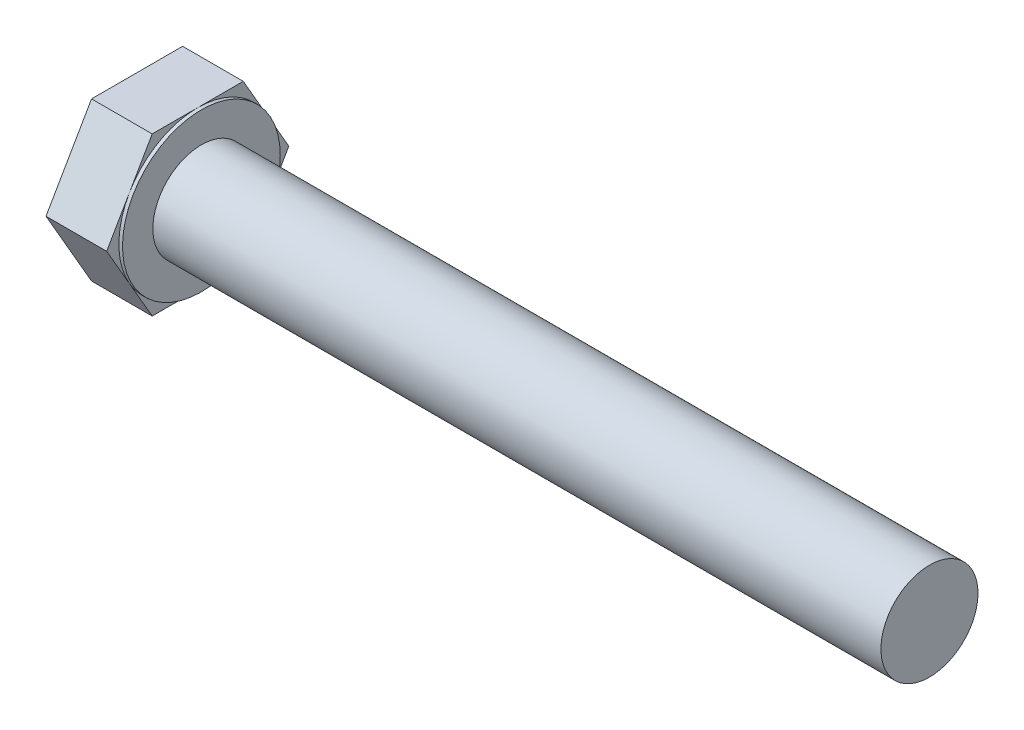
ISO-10303-21;
HEADER;
FILE_DESCRIPTION(('STEP AP214'),'2;1');
FILE_NAME('part.step','',(''),(''),'','','');
FILE_SCHEMA(('AUTOMOTIVE_DESIGN { 1 0 10303 214 1 1 1 1 }'));
ENDSEC;
DATA;
#1=APPLICATION_CONTEXT('core data for automotive mechanical design processes');
#2=APPLICATION_PROTOCOL_DEFINITION('international standard','automotive_design',2000,#1);
#3=PRODUCT_CONTEXT('',#1,'mechanical');
#4=PRODUCT('Part','Part','',(#3));
#5=PRODUCT_RELATED_PRODUCT_CATEGORY('part','',(#4));
#6=PRODUCT_DEFINITION_FORMATION('','',#4);
#7=PRODUCT_DEFINITION_CONTEXT('part definition',#1,'design');
#8=PRODUCT_DEFINITION('design','',#6,#7);
#9=PRODUCT_DEFINITION_SHAPE('','',#8);
#10=(LENGTH_UNIT() NAMED_UNIT(*) SI_UNIT(.MILLI.,.METRE.));
#11=(NAMED_UNIT(*) PLANE_ANGLE_UNIT() SI_UNIT($,.RADIAN.));
#12=(NAMED_UNIT(*) SI_UNIT($,.STERADIAN.) SOLID_ANGLE_UNIT());
#13=UNCERTAINTY_MEASURE_WITH_UNIT(LENGTH_MEASURE(1.E-05),#10,'distance_accuracy_value','');
#14=(GEOMETRIC_REPRESENTATION_CONTEXT(3) GLOBAL_UNCERTAINTY_ASSIGNED_CONTEXT((#13)) GLOBAL_UNIT_ASSIGNED_CONTEXT((#10,
#11,#12)) REPRESENTATION_CONTEXT('',''));
#15=CARTESIAN_POINT('',(0.,0.,0.));
#16=DIRECTION('',(0.,0.,1.));
#17=DIRECTION('',(1.,0.,0.));
#18=AXIS2_PLACEMENT_3D('',#15,#16,#17);
#19=CARTESIAN_POINT('',(0.3,0.,0.));
#20=DIRECTION('',(1.,0.,0.));
#21=DIRECTION('',(0.,0.,-1.));
#22=AXIS2_PLACEMENT_3D('',#19,#20,#21);
#23=PLANE('',#22);
#24=CARTESIAN_POINT('',(0.3,0.,0.));
#25=DIRECTION('',(1.,0.,0.));
#26=DIRECTION('',(0.,0.,-1.));
#27=AXIS2_PLACEMENT_3D('',#24,#25,#26);
#28=CIRCLE('',#27,6.50000000000004);
#29=CARTESIAN_POINT('',(0.3,0.,-6.50000000000004));
#30=VERTEX_POINT('',#29);
#31=EDGE_CURVE('E128',#30,#30,#28,.T.);
#32=ORIENTED_EDGE('',*,*,#31,.T.);
#33=EDGE_LOOP('',(#32));
#34=FACE_BOUND('',#33,.T.);
#35=CARTESIAN_POINT('',(0.3,0.,0.));
#36=DIRECTION('',(1.,0.,0.));
#37=DIRECTION('',(0.,0.,-1.));
#38=AXIS2_PLACEMENT_3D('',#35,#36,#37);
#39=CIRCLE('',#38,4.);
#40=CARTESIAN_POINT('',(0.3,0.,-4.));
#41=VERTEX_POINT('',#40);
#42=EDGE_CURVE('E351',#41,#41,#39,.T.);
#43=ORIENTED_EDGE('',*,*,#42,.F.);
#44=EDGE_LOOP('',(#43));
#45=FACE_BOUND('',#44,.T.);
#46=ADVANCED_FACE('F35',(#34,#45),#23,.T.);
#47=CARTESIAN_POINT('',(0.,0.,0.));
#48=DIRECTION('',(1.,0.,0.));
#49=DIRECTION('',(0.,0.,-1.));
#50=AXIS2_PLACEMENT_3D('',#47,#48,#49);
#51=PLANE('',#50);
#52=CARTESIAN_POINT('',(0.,0.,0.));
#53=DIRECTION('',(1.,0.,0.));
#54=DIRECTION('',(0.,0.,-1.));
#55=AXIS2_PLACEMENT_3D('',#52,#53,#54);
#56=CIRCLE('',#55,6.50000000000004);
#57=CARTESIAN_POINT('',(0.,3.25000000000007,-5.62916512459886));
#58=VERTEX_POINT('',#57);
#59=CARTESIAN_POINT('',(0.,6.5,0.));
#60=VERTEX_POINT('',#59);
#61=EDGE_CURVE('E46',#58,#60,#56,.T.);
#62=ORIENTED_EDGE('',*,*,#61,.F.);
#63=DIRECTION('',(0.,0.866025403784435,0.500000000000007));
#64=VECTOR('',#63,1.);
#65=CARTESIAN_POINT('',(0.,0.,-7.50555349946514));
#66=LINE('',#65,#64);
#67=CARTESIAN_POINT('',(0.,6.50000000000004,-3.75277674973251));
#68=VERTEX_POINT('',#67);
#69=EDGE_CURVE('E113',#58,#68,#66,.T.);
#70=ORIENTED_EDGE('',*,*,#69,.T.);
#71=DIRECTION('',(0.,0.,1.));
#72=VECTOR('',#71,1.);
#73=CARTESIAN_POINT('',(0.,6.50000000000004,-3.75277674973251));
#74=LINE('',#73,#72);
#75=EDGE_CURVE('E126',#68,#60,#74,.T.);
#76=ORIENTED_EDGE('',*,*,#75,.T.);
#77=EDGE_LOOP('',(#62,#70,#76));
#78=FACE_BOUND('',#77,.T.);
#79=ADVANCED_FACE('F125',(#78),#51,.T.);
#80=CARTESIAN_POINT('',(0.,3.24999999999998,5.62916512459889));
#81=VERTEX_POINT('',#80);
#82=EDGE_CURVE('E11',#60,#81,#56,.T.);
#83=ORIENTED_EDGE('',*,*,#82,.F.);
#84=CARTESIAN_POINT('',(0.,6.49999999999996,3.75277674973265));
#85=VERTEX_POINT('',#84);
#86=EDGE_CURVE('E112',#60,#85,#74,.T.);
#87=ORIENTED_EDGE('',*,*,#86,.T.);
#88=DIRECTION('',(0.,-0.866025403784442,0.499999999999995));
#89=VECTOR('',#88,1.);
#90=CARTESIAN_POINT('',(0.,6.49999999999996,3.75277674973265));
#91=LINE('',#90,#89);
#92=EDGE_CURVE('E158',#85,#81,#91,.T.);
#93=ORIENTED_EDGE('',*,*,#92,.T.);
#94=EDGE_LOOP('',(#83,#87,#93));
#95=FACE_BOUND('',#94,.T.);
#96=ADVANCED_FACE('F211',(#95),#51,.T.);
#97=CARTESIAN_POINT('',(0.,-3.25000000000001,5.62916512459885));
#98=VERTEX_POINT('',#97);
#99=EDGE_CURVE('E44',#81,#98,#56,.T.);
#100=ORIENTED_EDGE('',*,*,#99,.F.);
#101=CARTESIAN_POINT('',(0.,0.,7.50555349946514));
#102=VERTEX_POINT('',#101);
#103=EDGE_CURVE('E161',#81,#102,#91,.T.);
#104=ORIENTED_EDGE('',*,*,#103,.T.);
#105=DIRECTION('',(0.,-0.866025403784438,-0.500000000000001));
#106=VECTOR('',#105,1.);
#107=CARTESIAN_POINT('',(0.,0.,7.50555349946514));
#108=LINE('',#107,#106);
#109=EDGE_CURVE('E162',#102,#98,#108,.T.);
#110=ORIENTED_EDGE('',*,*,#109,.T.);
#111=EDGE_LOOP('',(#100,#104,#110));
#112=FACE_BOUND('',#111,.T.);
#113=ADVANCED_FACE('F192',(#112),#51,.T.);
#114=CARTESIAN_POINT('',(0.,-6.5,0.));
#115=VERTEX_POINT('',#114);
#116=EDGE_CURVE('E135',#98,#115,#56,.T.);
#117=ORIENTED_EDGE('',*,*,#116,.F.);
#118=CARTESIAN_POINT('',(0.,-6.50000000000001,3.75277674973255));
#119=VERTEX_POINT('',#118);
#120=EDGE_CURVE('E160',#98,#119,#108,.T.);
#121=ORIENTED_EDGE('',*,*,#120,.T.);
#122=DIRECTION('',(0.,0.,-1.));
#123=VECTOR('',#122,1.);
#124=CARTESIAN_POINT('',(0.,-6.50000000000001,3.75277674973255));
#125=LINE('',#124,#123);
#126=EDGE_CURVE('E166',#119,#115,#125,.T.);
#127=ORIENTED_EDGE('',*,*,#126,.T.);
#128=EDGE_LOOP('',(#117,#121,#127));
#129=FACE_BOUND('',#128,.T.);
#130=ADVANCED_FACE('F194',(#129),#51,.T.);
#131=CARTESIAN_POINT('',(0.,-3.24999999999997,-5.62916512459887));
#132=VERTEX_POINT('',#131);
#133=EDGE_CURVE('E133',#115,#132,#56,.T.);
#134=ORIENTED_EDGE('',*,*,#133,.F.);
#135=CARTESIAN_POINT('',(0.,-6.49999999999999,-3.7527767497326));
#136=VERTEX_POINT('',#135);
#137=EDGE_CURVE('E165',#115,#136,#125,.T.);
#138=ORIENTED_EDGE('',*,*,#137,.T.);
#139=DIRECTION('',(0.,0.866025403784442,-0.499999999999995));
#140=VECTOR('',#139,1.);
#141=CARTESIAN_POINT('',(0.,-6.49999999999999,-3.7527767497326));
#142=LINE('',#141,#140);
#143=EDGE_CURVE('E123',#136,#132,#142,.T.);
#144=ORIENTED_EDGE('',*,*,#143,.T.);
#145=EDGE_LOOP('',(#134,#138,#144));
#146=FACE_BOUND('',#145,.T.);
#147=ADVANCED_FACE('F201',(#146),#51,.T.);
#148=CARTESIAN_POINT('',(-5.,6.49999999999996,3.75277674973265));
#149=DIRECTION('',(0.,0.499999999999995,0.866025403784442));
#150=DIRECTION('',(0.,-0.866025403784442,0.499999999999995));
#151=AXIS2_PLACEMENT_3D('',#148,#149,#150);
#152=PLANE('',#151);
#153=ORIENTED_EDGE('',*,*,#92,.F.);
#154=DIRECTION('',(1.,0.,0.));
#155=VECTOR('',#154,1.);
#156=CARTESIAN_POINT('',(-5.,6.49999999999996,3.75277674973265));
#157=LINE('',#156,#155);
#158=CARTESIAN_POINT('',(-5.,6.49999999999996,3.75277674973265));
#159=VERTEX_POINT('',#158);
#160=EDGE_CURVE('E134',#159,#85,#157,.T.);
#161=ORIENTED_EDGE('',*,*,#160,.F.);
#162=DIRECTION('',(0.,-0.866025403784442,0.499999999999995));
#163=VECTOR('',#162,1.);
#164=CARTESIAN_POINT('',(-5.,6.49999999999996,3.75277674973265));
#165=LINE('',#164,#163);
#166=CARTESIAN_POINT('',(-5.,0.,7.50555349946514));
#167=VERTEX_POINT('',#166);
#168=EDGE_CURVE('E141',#159,#167,#165,.T.);
#169=ORIENTED_EDGE('',*,*,#168,.T.);
#170=DIRECTION('',(1.,0.,0.));
#171=VECTOR('',#170,1.);
#172=CARTESIAN_POINT('',(-5.,0.,7.50555349946514));
#173=LINE('',#172,#171);
#174=EDGE_CURVE('E39',#167,#102,#173,.T.);
#175=ORIENTED_EDGE('',*,*,#174,.T.);
#176=ORIENTED_EDGE('',*,*,#103,.F.);
#177=EDGE_LOOP('',(#153,#161,#169,#175,#176));
#178=FACE_BOUND('',#177,.T.);
#179=ADVANCED_FACE('F37',(#178),#152,.T.);
#180=CARTESIAN_POINT('',(-5.,6.50000000000004,-3.75277674973251));
#181=DIRECTION('',(0.,1.,0.));
#182=DIRECTION('',(0.,0.,1.));
#183=AXIS2_PLACEMENT_3D('',#180,#181,#182);
#184=PLANE('',#183);
#185=ORIENTED_EDGE('',*,*,#75,.F.);
#186=DIRECTION('',(1.,0.,0.));
#187=VECTOR('',#186,1.);
#188=CARTESIAN_POINT('',(-5.,6.50000000000004,-3.75277674973251));
#189=LINE('',#188,#187);
#190=CARTESIAN_POINT('',(-5.,6.50000000000004,-3.75277674973251));
#191=VERTEX_POINT('',#190);
#192=EDGE_CURVE('E119',#191,#68,#189,.T.);
#193=ORIENTED_EDGE('',*,*,#192,.F.);
#194=DIRECTION('',(0.,0.,1.));
#195=VECTOR('',#194,1.);
#196=CARTESIAN_POINT('',(-5.,6.50000000000004,-3.75277674973251));
#197=LINE('',#196,#195);
#198=EDGE_CURVE('E155',#191,#159,#197,.T.);
#199=ORIENTED_EDGE('',*,*,#198,.T.);
#200=ORIENTED_EDGE('',*,*,#160,.T.);
#201=ORIENTED_EDGE('',*,*,#86,.F.);
#202=EDGE_LOOP('',(#185,#193,#199,#200,#201));
#203=FACE_BOUND('',#202,.T.);
#204=ADVANCED_FACE('F210',(#203),#184,.T.);
#205=CARTESIAN_POINT('',(-5.,0.,-7.50555349946514));
#206=DIRECTION('',(0.,0.500000000000007,-0.866025403784435));
#207=DIRECTION('',(0.,0.866025403784435,0.500000000000007));
#208=AXIS2_PLACEMENT_3D('',#205,#206,#207);
#209=PLANE('',#208);
#210=CARTESIAN_POINT('',(0.,0.,-7.50555349946514));
#211=VERTEX_POINT('',#210);
#212=EDGE_CURVE('E106',#211,#58,#66,.T.);
#213=ORIENTED_EDGE('',*,*,#212,.F.);
#214=DIRECTION('',(1.,0.,0.));
#215=VECTOR('',#214,1.);
#216=CARTESIAN_POINT('',(-5.,0.,-7.50555349946514));
#217=LINE('',#216,#215);
#218=CARTESIAN_POINT('',(-5.,0.,-7.50555349946514));
#219=VERTEX_POINT('',#218);
#220=EDGE_CURVE('E173',#219,#211,#217,.T.);
#221=ORIENTED_EDGE('',*,*,#220,.F.);
#222=DIRECTION('',(0.,0.866025403784435,0.500000000000007));
#223=VECTOR('',#222,1.);
#224=CARTESIAN_POINT('',(-5.,0.,-7.50555349946514));
#225=LINE('',#224,#223);
#226=EDGE_CURVE('E153',#219,#191,#225,.T.);
#227=ORIENTED_EDGE('',*,*,#226,.T.);
#228=ORIENTED_EDGE('',*,*,#192,.T.);
#229=ORIENTED_EDGE('',*,*,#69,.F.);
#230=EDGE_LOOP('',(#213,#221,#227,#228,#229));
#231=FACE_BOUND('',#230,.T.);
#232=ADVANCED_FACE('F117',(#231),#209,.T.);
#233=CARTESIAN_POINT('',(-5.,-6.49999999999999,-3.7527767497326));
#234=DIRECTION('',(0.,-0.499999999999995,-0.866025403784442));
#235=DIRECTION('',(0.,0.866025403784442,-0.499999999999995));
#236=AXIS2_PLACEMENT_3D('',#233,#234,#235);
#237=PLANE('',#236);
#238=ORIENTED_EDGE('',*,*,#143,.F.);
#239=DIRECTION('',(1.,0.,0.));
#240=VECTOR('',#239,1.);
#241=CARTESIAN_POINT('',(-5.,-6.49999999999999,-3.7527767497326));
#242=LINE('',#241,#240);
#243=CARTESIAN_POINT('',(-5.,-6.49999999999999,-3.7527767497326));
#244=VERTEX_POINT('',#243);
#245=EDGE_CURVE('E175',#244,#136,#242,.T.);
#246=ORIENTED_EDGE('',*,*,#245,.F.);
#247=DIRECTION('',(0.,0.866025403784442,-0.499999999999995));
#248=VECTOR('',#247,1.);
#249=CARTESIAN_POINT('',(-5.,-6.49999999999999,-3.7527767497326));
#250=LINE('',#249,#248);
#251=EDGE_CURVE('E150',#244,#219,#250,.T.);
#252=ORIENTED_EDGE('',*,*,#251,.T.);
#253=ORIENTED_EDGE('',*,*,#220,.T.);
#254=EDGE_CURVE('E109',#132,#211,#142,.T.);
#255=ORIENTED_EDGE('',*,*,#254,.F.);
#256=EDGE_LOOP('',(#238,#246,#252,#253,#255));
#257=FACE_BOUND('',#256,.T.);
#258=ADVANCED_FACE('F203',(#257),#237,.T.);
#259=CARTESIAN_POINT('',(-5.,-6.50000000000001,3.75277674973255));
#260=DIRECTION('',(0.,-1.,0.));
#261=DIRECTION('',(0.,0.,-1.));
#262=AXIS2_PLACEMENT_3D('',#259,#260,#261);
#263=PLANE('',#262);
#264=ORIENTED_EDGE('',*,*,#126,.F.);
#265=DIRECTION('',(1.,0.,0.));
#266=VECTOR('',#265,1.);
#267=CARTESIAN_POINT('',(-5.,-6.50000000000001,3.75277674973255));
#268=LINE('',#267,#266);
#269=CARTESIAN_POINT('',(-5.,-6.50000000000001,3.75277674973255));
#270=VERTEX_POINT('',#269);
#271=EDGE_CURVE('E177',#270,#119,#268,.T.);
#272=ORIENTED_EDGE('',*,*,#271,.F.);
#273=DIRECTION('',(0.,0.,-1.));
#274=VECTOR('',#273,1.);
#275=CARTESIAN_POINT('',(-5.,-6.50000000000001,3.75277674973255));
#276=LINE('',#275,#274);
#277=EDGE_CURVE('E147',#270,#244,#276,.T.);
#278=ORIENTED_EDGE('',*,*,#277,.T.);
#279=ORIENTED_EDGE('',*,*,#245,.T.);
#280=ORIENTED_EDGE('',*,*,#137,.F.);
#281=EDGE_LOOP('',(#264,#272,#278,#279,#280));
#282=FACE_BOUND('',#281,.T.);
#283=ADVANCED_FACE('F197',(#282),#263,.T.);
#284=CARTESIAN_POINT('',(-5.,0.,7.50555349946514));
#285=DIRECTION('',(0.,-0.500000000000001,0.866025403784438));
#286=DIRECTION('',(0.,-0.866025403784438,-0.500000000000001));
#287=AXIS2_PLACEMENT_3D('',#284,#285,#286);
#288=PLANE('',#287);
#289=ORIENTED_EDGE('',*,*,#109,.F.);
#290=ORIENTED_EDGE('',*,*,#174,.F.);
#291=DIRECTION('',(0.,-0.866025403784438,-0.500000000000001));
#292=VECTOR('',#291,1.);
#293=CARTESIAN_POINT('',(-5.,0.,7.50555349946514));
#294=LINE('',#293,#292);
#295=EDGE_CURVE('E144',#167,#270,#294,.T.);
#296=ORIENTED_EDGE('',*,*,#295,.T.);
#297=ORIENTED_EDGE('',*,*,#271,.T.);
#298=ORIENTED_EDGE('',*,*,#120,.F.);
#299=EDGE_LOOP('',(#289,#290,#296,#297,#298));
#300=FACE_BOUND('',#299,.T.);
#301=ADVANCED_FACE('F189',(#300),#288,.T.);
#302=CARTESIAN_POINT('',(-5.,0.,0.));
#303=DIRECTION('',(1.,0.,0.));
#304=DIRECTION('',(0.,0.,-1.));
#305=AXIS2_PLACEMENT_3D('',#302,#303,#304);
#306=PLANE('',#305);
#307=ORIENTED_EDGE('',*,*,#168,.F.);
#308=ORIENTED_EDGE('',*,*,#198,.F.);
#309=ORIENTED_EDGE('',*,*,#226,.F.);
#310=ORIENTED_EDGE('',*,*,#251,.F.);
#311=ORIENTED_EDGE('',*,*,#277,.F.);
#312=ORIENTED_EDGE('',*,*,#295,.F.);
#313=EDGE_LOOP('',(#307,#308,#309,#310,#311,#312));
#314=FACE_BOUND('',#313,.T.);
#315=ADVANCED_FACE('F208',(#314),#306,.F.);
#316=EDGE_CURVE('E59',#132,#58,#56,.T.);
#317=ORIENTED_EDGE('',*,*,#316,.F.);
#318=ORIENTED_EDGE('',*,*,#254,.T.);
#319=ORIENTED_EDGE('',*,*,#212,.T.);
#320=EDGE_LOOP('',(#317,#318,#319));
#321=FACE_BOUND('',#320,.T.);
#322=ADVANCED_FACE('F108',(#321),#51,.T.);
#323=CARTESIAN_POINT('',(0.3,0.,0.));
#324=DIRECTION('',(-1.,0.,0.));
#325=DIRECTION('',(0.,0.,1.));
#326=AXIS2_PLACEMENT_3D('',#323,#324,#325);
#327=CYLINDRICAL_SURFACE('',#326,6.50000000000004);
#328=ORIENTED_EDGE('',*,*,#31,.F.);
#329=EDGE_LOOP('',(#328));
#330=FACE_BOUND('',#329,.T.);
#331=ORIENTED_EDGE('',*,*,#61,.T.);
#332=ORIENTED_EDGE('',*,*,#82,.T.);
#333=ORIENTED_EDGE('',*,*,#99,.T.);
#334=ORIENTED_EDGE('',*,*,#116,.T.);
#335=ORIENTED_EDGE('',*,*,#133,.T.);
#336=ORIENTED_EDGE('',*,*,#316,.T.);
#337=EDGE_LOOP('',(#331,#332,#333,#334,#335,#336));
#338=FACE_BOUND('',#337,.T.);
#339=ADVANCED_FACE('F131',(#330,#338),#327,.T.);
#340=CARTESIAN_POINT('',(60.3,0.,0.));
#341=DIRECTION('',(-1.,0.,0.));
#342=DIRECTION('',(0.,0.,1.));
#343=AXIS2_PLACEMENT_3D('',#340,#341,#342);
#344=CYLINDRICAL_SURFACE('',#343,4.);
#345=CARTESIAN_POINT('',(60.3,0.,0.));
#346=DIRECTION('',(1.,0.,0.));
#347=DIRECTION('',(0.,0.,-1.));
#348=AXIS2_PLACEMENT_3D('',#345,#346,#347);
#349=CIRCLE('',#348,4.);
#350=CARTESIAN_POINT('',(60.3,0.,-4.));
#351=VERTEX_POINT('',#350);
#352=EDGE_CURVE('E129',#351,#351,#349,.T.);
#353=ORIENTED_EDGE('',*,*,#352,.F.);
#354=EDGE_LOOP('',(#353));
#355=FACE_BOUND('',#354,.T.);
#356=ORIENTED_EDGE('',*,*,#42,.T.);
#357=EDGE_LOOP('',(#356));
#358=FACE_BOUND('',#357,.T.);
#359=ADVANCED_FACE('F229',(#355,#358),#344,.T.);
#360=CARTESIAN_POINT('',(60.3,0.,0.));
#361=DIRECTION('',(1.,0.,0.));
#362=DIRECTION('',(0.,0.,-1.));
#363=AXIS2_PLACEMENT_3D('',#360,#361,#362);
#364=PLANE('',#363);
#365=ORIENTED_EDGE('',*,*,#352,.T.);
#366=EDGE_LOOP('',(#365));
#367=FACE_BOUND('',#366,.T.);
#368=ADVANCED_FACE('F337',(#367),#364,.T.);
#369=CLOSED_SHELL('',(#46,#79,#96,#113,#130,#147,#179,#204,#232,#258,#283,#301,#315,#322,#339,
#359,#368));
#370=MANIFOLD_SOLID_BREP('B2',#369);
#371=ADVANCED_BREP_SHAPE_REPRESENTATION('',(#18,#370),#14);
#372=SHAPE_DEFINITION_REPRESENTATION(#9,#371);
ENDSEC;
END-ISO-10303-21;
